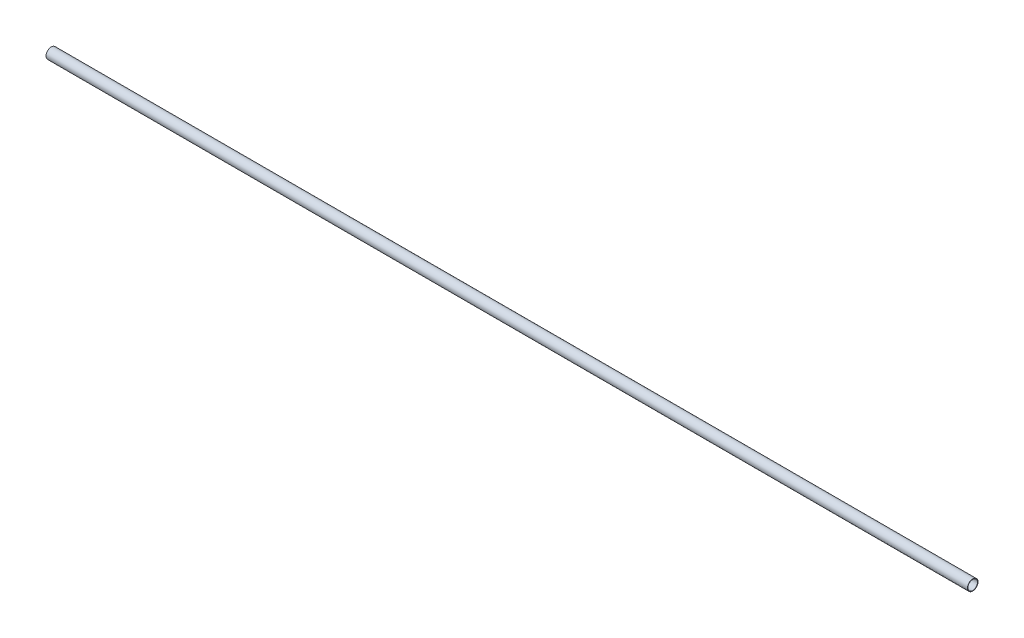
ISO-10303-21;
HEADER;
FILE_DESCRIPTION(('STEP AP214'),'2;1');
FILE_NAME('part.step','',(''),(''),'','','');
FILE_SCHEMA(('AUTOMOTIVE_DESIGN { 1 0 10303 214 1 1 1 1 }'));
ENDSEC;
DATA;
#1=APPLICATION_CONTEXT('core data for automotive mechanical design processes');
#2=APPLICATION_PROTOCOL_DEFINITION('international standard','automotive_design',2000,#1);
#3=PRODUCT_CONTEXT('',#1,'mechanical');
#4=PRODUCT('Part','Part','',(#3));
#5=PRODUCT_RELATED_PRODUCT_CATEGORY('part','',(#4));
#6=PRODUCT_DEFINITION_FORMATION('','',#4);
#7=PRODUCT_DEFINITION_CONTEXT('part definition',#1,'design');
#8=PRODUCT_DEFINITION('design','',#6,#7);
#9=PRODUCT_DEFINITION_SHAPE('','',#8);
#10=(LENGTH_UNIT() NAMED_UNIT(*) SI_UNIT(.MILLI.,.METRE.));
#11=(NAMED_UNIT(*) PLANE_ANGLE_UNIT() SI_UNIT($,.RADIAN.));
#12=(NAMED_UNIT(*) SI_UNIT($,.STERADIAN.) SOLID_ANGLE_UNIT());
#13=UNCERTAINTY_MEASURE_WITH_UNIT(LENGTH_MEASURE(1.E-05),#10,'distance_accuracy_value','');
#14=(GEOMETRIC_REPRESENTATION_CONTEXT(3) GLOBAL_UNCERTAINTY_ASSIGNED_CONTEXT((#13)) GLOBAL_UNIT_ASSIGNED_CONTEXT((#10,
#11,#12)) REPRESENTATION_CONTEXT('',''));
#15=CARTESIAN_POINT('',(0.,0.,0.));
#16=DIRECTION('',(0.,0.,1.));
#17=DIRECTION('',(1.,0.,0.));
#18=AXIS2_PLACEMENT_3D('',#15,#16,#17);
#19=CARTESIAN_POINT('',(1219.2,0.,0.));
#20=DIRECTION('',(-1.,0.,0.));
#21=DIRECTION('',(0.,0.,1.));
#22=AXIS2_PLACEMENT_3D('',#19,#20,#21);
#23=CYLINDRICAL_SURFACE('',#22,6.985);
#24=CARTESIAN_POINT('',(1219.2,0.,0.));
#25=DIRECTION('',(1.,0.,0.));
#26=DIRECTION('',(0.,0.,-1.));
#27=AXIS2_PLACEMENT_3D('',#24,#25,#26);
#28=CIRCLE('',#27,6.985);
#29=CARTESIAN_POINT('',(1219.2,0.,6.985));
#30=VERTEX_POINT('',#29);
#31=EDGE_CURVE('E10',#30,#30,#28,.T.);
#32=CARTESIAN_POINT('',(0.,0.,0.));
#33=DIRECTION('',(1.,0.,0.));
#34=DIRECTION('',(0.,0.,-1.));
#35=AXIS2_PLACEMENT_3D('',#32,#33,#34);
#36=CIRCLE('',#35,6.985);
#37=CARTESIAN_POINT('',(0.,0.,6.985));
#38=VERTEX_POINT('',#37);
#39=EDGE_CURVE('E35',#38,#38,#36,.T.);
#40=CARTESIAN_POINT('',(1219.2,0.,6.985));
#41=CARTESIAN_POINT('',(1206.5,0.,6.985));
#42=CARTESIAN_POINT('',(1193.8,0.,6.985));
#43=CARTESIAN_POINT('',(1168.4,0.,6.985));
#44=CARTESIAN_POINT('',(1155.7,0.,6.985));
#45=CARTESIAN_POINT('',(1130.3,0.,6.985));
#46=CARTESIAN_POINT('',(1117.6,0.,6.985));
#47=CARTESIAN_POINT('',(1092.2,0.,6.985));
#48=CARTESIAN_POINT('',(1079.5,0.,6.985));
#49=CARTESIAN_POINT('',(1054.1,0.,6.985));
#50=CARTESIAN_POINT('',(1041.4,0.,6.985));
#51=CARTESIAN_POINT('',(1016.,0.,6.985));
#52=CARTESIAN_POINT('',(1003.3,0.,6.985));
#53=CARTESIAN_POINT('',(977.9,0.,6.985));
#54=CARTESIAN_POINT('',(965.2,0.,6.985));
#55=CARTESIAN_POINT('',(939.8,0.,6.985));
#56=CARTESIAN_POINT('',(927.1,0.,6.985));
#57=CARTESIAN_POINT('',(901.7,0.,6.985));
#58=CARTESIAN_POINT('',(889.,0.,6.985));
#59=CARTESIAN_POINT('',(863.6,0.,6.985));
#60=CARTESIAN_POINT('',(850.9,0.,6.985));
#61=CARTESIAN_POINT('',(825.5,0.,6.985));
#62=CARTESIAN_POINT('',(812.8,0.,6.985));
#63=CARTESIAN_POINT('',(787.4,0.,6.985));
#64=CARTESIAN_POINT('',(774.7,0.,6.985));
#65=CARTESIAN_POINT('',(749.3,0.,6.985));
#66=CARTESIAN_POINT('',(736.6,0.,6.985));
#67=CARTESIAN_POINT('',(711.2,0.,6.985));
#68=CARTESIAN_POINT('',(698.5,0.,6.985));
#69=CARTESIAN_POINT('',(673.1,0.,6.985));
#70=CARTESIAN_POINT('',(660.4,0.,6.985));
#71=CARTESIAN_POINT('',(635.,0.,6.985));
#72=CARTESIAN_POINT('',(622.3,0.,6.985));
#73=CARTESIAN_POINT('',(596.9,0.,6.985));
#74=CARTESIAN_POINT('',(584.2,0.,6.985));
#75=CARTESIAN_POINT('',(558.8,0.,6.985));
#76=CARTESIAN_POINT('',(546.1,0.,6.985));
#77=CARTESIAN_POINT('',(520.7,0.,6.985));
#78=CARTESIAN_POINT('',(508.,0.,6.985));
#79=CARTESIAN_POINT('',(482.6,0.,6.985));
#80=CARTESIAN_POINT('',(469.9,0.,6.985));
#81=CARTESIAN_POINT('',(444.5,0.,6.985));
#82=CARTESIAN_POINT('',(431.8,0.,6.985));
#83=CARTESIAN_POINT('',(406.4,0.,6.985));
#84=CARTESIAN_POINT('',(393.7,0.,6.985));
#85=CARTESIAN_POINT('',(368.3,0.,6.985));
#86=CARTESIAN_POINT('',(355.6,0.,6.985));
#87=CARTESIAN_POINT('',(330.2,0.,6.985));
#88=CARTESIAN_POINT('',(317.5,0.,6.985));
#89=CARTESIAN_POINT('',(292.1,0.,6.985));
#90=CARTESIAN_POINT('',(279.4,0.,6.985));
#91=CARTESIAN_POINT('',(254.,0.,6.985));
#92=CARTESIAN_POINT('',(241.3,0.,6.985));
#93=CARTESIAN_POINT('',(215.9,0.,6.985));
#94=CARTESIAN_POINT('',(203.2,0.,6.985));
#95=CARTESIAN_POINT('',(177.8,0.,6.985));
#96=CARTESIAN_POINT('',(165.1,0.,6.985));
#97=CARTESIAN_POINT('',(139.7,0.,6.985));
#98=CARTESIAN_POINT('',(127.,0.,6.985));
#99=CARTESIAN_POINT('',(101.6,0.,6.985));
#100=CARTESIAN_POINT('',(88.9,0.,6.985));
#101=CARTESIAN_POINT('',(63.5,0.,6.985));
#102=CARTESIAN_POINT('',(50.8,0.,6.985));
#103=CARTESIAN_POINT('',(25.4,0.,6.985));
#104=CARTESIAN_POINT('',(12.7,0.,6.985));
#105=CARTESIAN_POINT('',(0.,0.,6.985));
#106=B_SPLINE_CURVE_WITH_KNOTS('',3,(#40,#41,#42,#43,#44,#45,#46,#47,#48,#49,#50,#51,#52,#53,
#54,#55,#56,#57,#58,#59,#60,#61,#62,#63,#64,#65,#66,#67,#68,#69,#70,#71,#72,#73,#74,#75,#76,#77,
#78,#79,#80,#81,#82,#83,#84,#85,#86,#87,#88,#89,#90,#91,#92,#93,#94,#95,#96,#97,#98,#99,#100,
#101,#102,#103,#104,#105),.UNSPECIFIED.,.F.,.F.,(4,2,2,2,2,2,2,2,2,2,2,2,2,2,2,2,2,2,2,2,2,2,2,
2,2,2,2,2,2,2,2,2,4),(0.,38.1,76.2,114.3,152.4,190.5,228.6,266.7,304.8,342.9,381.,419.1,457.2,
495.3,533.4,571.5,609.6,647.7,685.8,723.9,762.,800.1,838.2,876.3,914.4,952.5,990.6,1028.7,
1066.8,1104.9,1143.,1181.1,1219.2),.UNSPECIFIED.);
#107=EDGE_CURVE('BSEAM32',#30,#38,#106,.T.);
#108=ORIENTED_EDGE('',*,*,#31,.F.);
#109=ORIENTED_EDGE('',*,*,#39,.T.);
#110=ORIENTED_EDGE('',*,*,#107,.T.);
#111=ORIENTED_EDGE('',*,*,#107,.F.);
#112=EDGE_LOOP('',(#108,#110,#109,#111));
#113=FACE_BOUND('',#112,.T.);
#114=ADVANCED_FACE('F32',(#113),#23,.T.);
#115=CARTESIAN_POINT('',(1219.2,0.,0.));
#116=DIRECTION('',(1.,0.,0.));
#117=DIRECTION('',(0.,0.,-1.));
#118=AXIS2_PLACEMENT_3D('',#115,#116,#117);
#119=PLANE('',#118);
#120=CARTESIAN_POINT('',(1219.2,0.,0.));
#121=DIRECTION('',(-1.,0.,0.));
#122=DIRECTION('',(0.,0.,1.));
#123=AXIS2_PLACEMENT_3D('',#120,#121,#122);
#124=CIRCLE('',#123,6.35);
#125=CARTESIAN_POINT('',(1219.2,0.,6.35));
#126=VERTEX_POINT('',#125);
#127=EDGE_CURVE('E42',#126,#126,#124,.T.);
#128=ORIENTED_EDGE('',*,*,#127,.T.);
#129=EDGE_LOOP('',(#128));
#130=FACE_BOUND('',#129,.T.);
#131=ORIENTED_EDGE('',*,*,#31,.T.);
#132=EDGE_LOOP('',(#131));
#133=FACE_BOUND('',#132,.T.);
#134=ADVANCED_FACE('F50',(#130,#133),#119,.T.);
#135=CARTESIAN_POINT('',(0.,0.,0.));
#136=DIRECTION('',(1.,0.,0.));
#137=DIRECTION('',(0.,0.,-1.));
#138=AXIS2_PLACEMENT_3D('',#135,#136,#137);
#139=PLANE('',#138);
#140=CARTESIAN_POINT('',(0.,0.,0.));
#141=DIRECTION('',(-1.,0.,0.));
#142=DIRECTION('',(0.,0.,1.));
#143=AXIS2_PLACEMENT_3D('',#140,#141,#142);
#144=CIRCLE('',#143,6.35);
#145=CARTESIAN_POINT('',(0.,0.,6.35));
#146=VERTEX_POINT('',#145);
#147=EDGE_CURVE('E44',#146,#146,#144,.T.);
#148=ORIENTED_EDGE('',*,*,#147,.F.);
#149=EDGE_LOOP('',(#148));
#150=FACE_BOUND('',#149,.T.);
#151=ORIENTED_EDGE('',*,*,#39,.F.);
#152=EDGE_LOOP('',(#151));
#153=FACE_BOUND('',#152,.T.);
#154=ADVANCED_FACE('F55',(#150,#153),#139,.F.);
#155=CARTESIAN_POINT('',(1219.2,0.,0.));
#156=DIRECTION('',(-1.,0.,0.));
#157=DIRECTION('',(0.,0.,1.));
#158=AXIS2_PLACEMENT_3D('',#155,#156,#157);
#159=CYLINDRICAL_SURFACE('',#158,6.35);
#160=CARTESIAN_POINT('',(1219.2,0.,6.35));
#161=CARTESIAN_POINT('',(1206.5,0.,6.35));
#162=CARTESIAN_POINT('',(1193.8,0.,6.35));
#163=CARTESIAN_POINT('',(1168.4,0.,6.35));
#164=CARTESIAN_POINT('',(1155.7,0.,6.35));
#165=CARTESIAN_POINT('',(1130.3,0.,6.35));
#166=CARTESIAN_POINT('',(1117.6,0.,6.35));
#167=CARTESIAN_POINT('',(1092.2,0.,6.35));
#168=CARTESIAN_POINT('',(1079.5,0.,6.35));
#169=CARTESIAN_POINT('',(1054.1,0.,6.35));
#170=CARTESIAN_POINT('',(1041.4,0.,6.35));
#171=CARTESIAN_POINT('',(1016.,0.,6.35));
#172=CARTESIAN_POINT('',(1003.3,0.,6.35));
#173=CARTESIAN_POINT('',(977.9,0.,6.35));
#174=CARTESIAN_POINT('',(965.2,0.,6.35));
#175=CARTESIAN_POINT('',(939.8,0.,6.35));
#176=CARTESIAN_POINT('',(927.1,0.,6.35));
#177=CARTESIAN_POINT('',(901.7,0.,6.35));
#178=CARTESIAN_POINT('',(889.,0.,6.35));
#179=CARTESIAN_POINT('',(863.6,0.,6.35));
#180=CARTESIAN_POINT('',(850.9,0.,6.35));
#181=CARTESIAN_POINT('',(825.5,0.,6.35));
#182=CARTESIAN_POINT('',(812.8,0.,6.35));
#183=CARTESIAN_POINT('',(787.4,0.,6.35));
#184=CARTESIAN_POINT('',(774.7,0.,6.35));
#185=CARTESIAN_POINT('',(749.3,0.,6.35));
#186=CARTESIAN_POINT('',(736.6,0.,6.35));
#187=CARTESIAN_POINT('',(711.2,0.,6.35));
#188=CARTESIAN_POINT('',(698.5,0.,6.35));
#189=CARTESIAN_POINT('',(673.1,0.,6.35));
#190=CARTESIAN_POINT('',(660.4,0.,6.35));
#191=CARTESIAN_POINT('',(635.,0.,6.35));
#192=CARTESIAN_POINT('',(622.3,0.,6.35));
#193=CARTESIAN_POINT('',(596.9,0.,6.35));
#194=CARTESIAN_POINT('',(584.2,0.,6.35));
#195=CARTESIAN_POINT('',(558.8,0.,6.35));
#196=CARTESIAN_POINT('',(546.1,0.,6.35));
#197=CARTESIAN_POINT('',(520.7,0.,6.35));
#198=CARTESIAN_POINT('',(508.,0.,6.35));
#199=CARTESIAN_POINT('',(482.6,0.,6.35));
#200=CARTESIAN_POINT('',(469.9,0.,6.35));
#201=CARTESIAN_POINT('',(444.5,0.,6.35));
#202=CARTESIAN_POINT('',(431.8,0.,6.35));
#203=CARTESIAN_POINT('',(406.4,0.,6.35));
#204=CARTESIAN_POINT('',(393.7,0.,6.35));
#205=CARTESIAN_POINT('',(368.3,0.,6.35));
#206=CARTESIAN_POINT('',(355.6,0.,6.35));
#207=CARTESIAN_POINT('',(330.2,0.,6.35));
#208=CARTESIAN_POINT('',(317.5,0.,6.35));
#209=CARTESIAN_POINT('',(292.1,0.,6.35));
#210=CARTESIAN_POINT('',(279.4,0.,6.35));
#211=CARTESIAN_POINT('',(254.,0.,6.35));
#212=CARTESIAN_POINT('',(241.3,0.,6.35));
#213=CARTESIAN_POINT('',(215.9,0.,6.35));
#214=CARTESIAN_POINT('',(203.2,0.,6.35));
#215=CARTESIAN_POINT('',(177.8,0.,6.35));
#216=CARTESIAN_POINT('',(165.1,0.,6.35));
#217=CARTESIAN_POINT('',(139.7,0.,6.35));
#218=CARTESIAN_POINT('',(127.,0.,6.35));
#219=CARTESIAN_POINT('',(101.6,0.,6.35));
#220=CARTESIAN_POINT('',(88.9,0.,6.35));
#221=CARTESIAN_POINT('',(63.5,0.,6.35));
#222=CARTESIAN_POINT('',(50.8,0.,6.35));
#223=CARTESIAN_POINT('',(25.4,0.,6.35));
#224=CARTESIAN_POINT('',(12.7,0.,6.35));
#225=CARTESIAN_POINT('',(0.,0.,6.35));
#226=B_SPLINE_CURVE_WITH_KNOTS('',3,(#160,#161,#162,#163,#164,#165,#166,#167,#168,#169,#170,
#171,#172,#173,#174,#175,#176,#177,#178,#179,#180,#181,#182,#183,#184,#185,#186,#187,#188,#189,
#190,#191,#192,#193,#194,#195,#196,#197,#198,#199,#200,#201,#202,#203,#204,#205,#206,#207,#208,
#209,#210,#211,#212,#213,#214,#215,#216,#217,#218,#219,#220,#221,#222,#223,#224,#225),
.UNSPECIFIED.,.F.,.F.,(4,2,2,2,2,2,2,2,2,2,2,2,2,2,2,2,2,2,2,2,2,2,2,2,2,2,2,2,2,2,2,2,4),(0.,
38.0999999999998,76.1999999999998,114.3,152.4,190.5,228.6,266.7,304.8,342.9,381.,419.1,457.2,
495.3,533.4,571.5,609.6,647.7,685.8,723.9,762.,800.1,838.2,876.3,914.4,952.5,990.6,1028.7,
1066.8,1104.9,1143.,1181.1,1219.2),.UNSPECIFIED.);
#227=EDGE_CURVE('BSEAM52',#126,#146,#226,.T.);
#228=ORIENTED_EDGE('',*,*,#127,.F.);
#229=ORIENTED_EDGE('',*,*,#147,.T.);
#230=ORIENTED_EDGE('',*,*,#227,.T.);
#231=ORIENTED_EDGE('',*,*,#227,.F.);
#232=EDGE_LOOP('',(#228,#230,#229,#231));
#233=FACE_BOUND('',#232,.T.);
#234=ADVANCED_FACE('F52',(#233),#159,.F.);
#235=CLOSED_SHELL('',(#114,#134,#154,#234));
#236=MANIFOLD_SOLID_BREP('B2',#235);
#237=ADVANCED_BREP_SHAPE_REPRESENTATION('',(#18,#236),#14);
#238=SHAPE_DEFINITION_REPRESENTATION(#9,#237);
ENDSEC;
END-ISO-10303-21;
